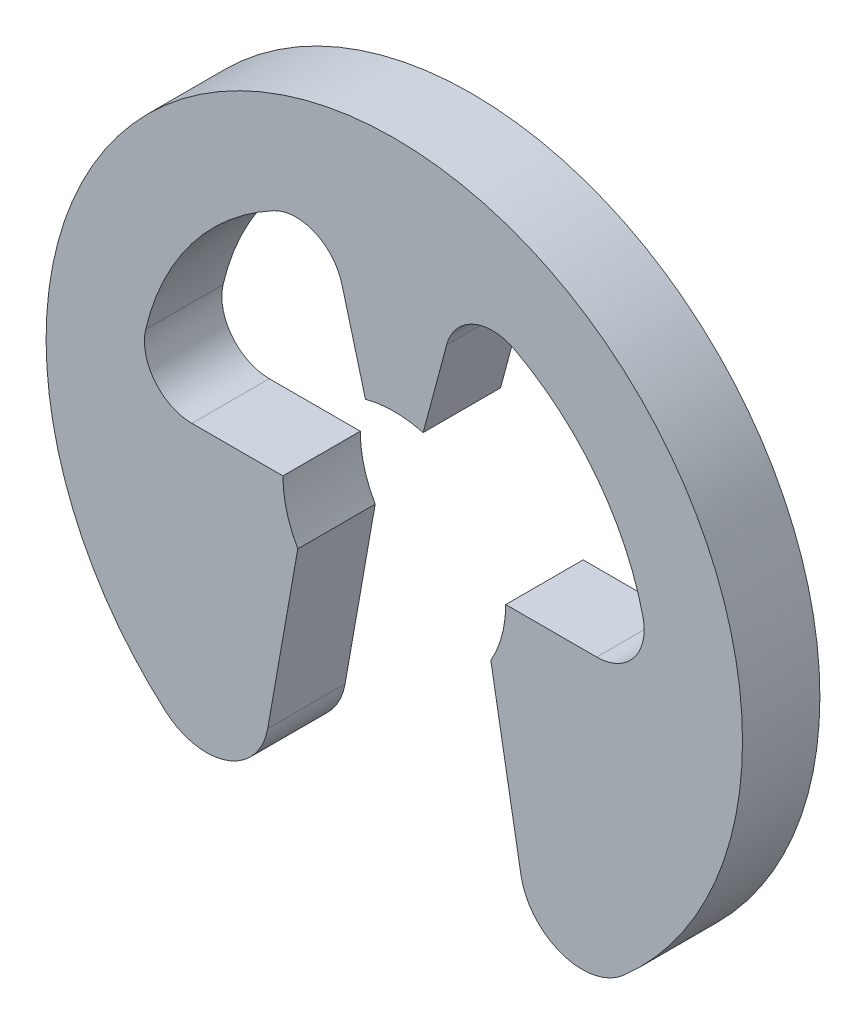
ISO-10303-21;
HEADER;
FILE_DESCRIPTION(('STEP AP214'),'2;1');
FILE_NAME('part.step','',(''),(''),'','','');
FILE_SCHEMA(('AUTOMOTIVE_DESIGN { 1 0 10303 214 1 1 1 1 }'));
ENDSEC;
DATA;
#1=APPLICATION_CONTEXT('core data for automotive mechanical design processes');
#2=APPLICATION_PROTOCOL_DEFINITION('international standard','automotive_design',2000,#1);
#3=PRODUCT_CONTEXT('',#1,'mechanical');
#4=PRODUCT('Part','Part','',(#3));
#5=PRODUCT_RELATED_PRODUCT_CATEGORY('part','',(#4));
#6=PRODUCT_DEFINITION_FORMATION('','',#4);
#7=PRODUCT_DEFINITION_CONTEXT('part definition',#1,'design');
#8=PRODUCT_DEFINITION('design','',#6,#7);
#9=PRODUCT_DEFINITION_SHAPE('','',#8);
#10=(LENGTH_UNIT() NAMED_UNIT(*) SI_UNIT(.MILLI.,.METRE.));
#11=(NAMED_UNIT(*) PLANE_ANGLE_UNIT() SI_UNIT($,.RADIAN.));
#12=(NAMED_UNIT(*) SI_UNIT($,.STERADIAN.) SOLID_ANGLE_UNIT());
#13=UNCERTAINTY_MEASURE_WITH_UNIT(LENGTH_MEASURE(1.E-05),#10,'distance_accuracy_value','');
#14=(GEOMETRIC_REPRESENTATION_CONTEXT(3) GLOBAL_UNCERTAINTY_ASSIGNED_CONTEXT((#13)) GLOBAL_UNIT_ASSIGNED_CONTEXT((#10,
#11,#12)) REPRESENTATION_CONTEXT('',''));
#15=CARTESIAN_POINT('',(0.,0.,0.));
#16=DIRECTION('',(0.,0.,1.));
#17=DIRECTION('',(1.,0.,0.));
#18=AXIS2_PLACEMENT_3D('',#15,#16,#17);
#19=CARTESIAN_POINT('',(0.653783220953245,0.15345,-0.25));
#20=DIRECTION('',(0.,0.,1.));
#21=DIRECTION('',(1.,0.,0.));
#22=AXIS2_PLACEMENT_3D('',#19,#20,#21);
#23=CYLINDRICAL_SURFACE('',#22,0.15345);
#24=CARTESIAN_POINT('',(0.653783220953245,0.15345,0.));
#25=DIRECTION('',(0.,0.,-1.));
#26=DIRECTION('',(1.,0.,0.));
#27=AXIS2_PLACEMENT_3D('',#24,#25,#26);
#28=CIRCLE('',#27,0.15345);
#29=CARTESIAN_POINT('',(0.803173490114552,0.188513513513514,0.));
#30=VERTEX_POINT('',#29);
#31=CARTESIAN_POINT('',(0.653783220953245,0.,0.));
#32=VERTEX_POINT('',#31);
#33=EDGE_CURVE('E187',#30,#32,#28,.T.);
#34=ORIENTED_EDGE('',*,*,#33,.F.);
#35=DIRECTION('',(0.,0.,1.));
#36=VECTOR('',#35,1.);
#37=CARTESIAN_POINT('',(0.803173490114552,0.188513513513514,-0.25));
#38=LINE('',#37,#36);
#39=CARTESIAN_POINT('',(0.803173490114552,0.188513513513514,-0.25));
#40=VERTEX_POINT('',#39);
#41=EDGE_CURVE('E11',#40,#30,#38,.T.);
#42=ORIENTED_EDGE('',*,*,#41,.F.);
#43=CARTESIAN_POINT('',(0.653783220953245,0.15345,-0.25));
#44=DIRECTION('',(0.,0.,-1.));
#45=DIRECTION('',(1.,0.,0.));
#46=AXIS2_PLACEMENT_3D('',#43,#44,#45);
#47=CIRCLE('',#46,0.15345);
#48=CARTESIAN_POINT('',(0.653783220953245,0.,-0.25));
#49=VERTEX_POINT('',#48);
#50=EDGE_CURVE('E237',#40,#49,#47,.T.);
#51=ORIENTED_EDGE('',*,*,#50,.T.);
#52=DIRECTION('',(0.,0.,1.));
#53=VECTOR('',#52,1.);
#54=CARTESIAN_POINT('',(0.653783220953245,0.,-0.25));
#55=LINE('',#54,#53);
#56=EDGE_CURVE('E33',#49,#32,#55,.T.);
#57=ORIENTED_EDGE('',*,*,#56,.T.);
#58=EDGE_LOOP('',(#34,#42,#51,#57));
#59=FACE_BOUND('',#58,.T.);
#60=ADVANCED_FACE('F30',(#59),#23,.F.);
#61=CARTESIAN_POINT('',(0.,0.,-0.25));
#62=DIRECTION('',(0.,0.,1.));
#63=DIRECTION('',(1.,0.,0.));
#64=AXIS2_PLACEMENT_3D('',#61,#62,#63);
#65=CYLINDRICAL_SURFACE('',#64,0.825);
#66=CARTESIAN_POINT('',(0.,0.,0.));
#67=DIRECTION('',(0.,0.,-1.));
#68=DIRECTION('',(1.,0.,0.));
#69=AXIS2_PLACEMENT_3D('',#66,#67,#68);
#70=CIRCLE('',#69,0.825);
#71=CARTESIAN_POINT('',(0.389966667070304,0.727015129535885,0.));
#72=VERTEX_POINT('',#71);
#73=EDGE_CURVE('E235',#72,#30,#70,.T.);
#74=ORIENTED_EDGE('',*,*,#73,.F.);
#75=DIRECTION('',(0.,0.,1.));
#76=VECTOR('',#75,1.);
#77=CARTESIAN_POINT('',(0.389966667070304,0.727015129535885,-0.25));
#78=LINE('',#77,#76);
#79=CARTESIAN_POINT('',(0.389966667070304,0.727015129535885,-0.25));
#80=VERTEX_POINT('',#79);
#81=EDGE_CURVE('E39',#80,#72,#78,.T.);
#82=ORIENTED_EDGE('',*,*,#81,.F.);
#83=CARTESIAN_POINT('',(0.,0.,-0.25));
#84=DIRECTION('',(0.,0.,-1.));
#85=DIRECTION('',(1.,0.,0.));
#86=AXIS2_PLACEMENT_3D('',#83,#84,#85);
#87=CIRCLE('',#86,0.825);
#88=EDGE_CURVE('E177',#80,#40,#87,.T.);
#89=ORIENTED_EDGE('',*,*,#88,.T.);
#90=ORIENTED_EDGE('',*,*,#41,.T.);
#91=EDGE_LOOP('',(#74,#82,#89,#90));
#92=FACE_BOUND('',#91,.T.);
#93=ADVANCED_FACE('F269',(#92),#65,.F.);
#94=CARTESIAN_POINT('',(0.317432866995227,0.591790315442209,-0.25));
#95=DIRECTION('',(0.,0.,1.));
#96=DIRECTION('',(1.,0.,0.));
#97=AXIS2_PLACEMENT_3D('',#94,#95,#96);
#98=CYLINDRICAL_SURFACE('',#97,0.153450000000001);
#99=CARTESIAN_POINT('',(0.317432866995227,0.591790315442209,0.));
#100=DIRECTION('',(0.,0.,-1.));
#101=DIRECTION('',(1.,0.,0.));
#102=AXIS2_PLACEMENT_3D('',#99,#100,#101);
#103=CIRCLE('',#102,0.153450000000001);
#104=CARTESIAN_POINT('',(0.169211548951169,0.63150609791319,0.));
#105=VERTEX_POINT('',#104);
#106=EDGE_CURVE('E164',#105,#72,#103,.T.);
#107=ORIENTED_EDGE('',*,*,#106,.F.);
#108=DIRECTION('',(0.,0.,1.));
#109=VECTOR('',#108,1.);
#110=CARTESIAN_POINT('',(0.169211548951169,0.63150609791319,-0.25));
#111=LINE('',#110,#109);
#112=CARTESIAN_POINT('',(0.169211548951169,0.63150609791319,-0.25));
#113=VERTEX_POINT('',#112);
#114=EDGE_CURVE('E159',#113,#105,#111,.T.);
#115=ORIENTED_EDGE('',*,*,#114,.F.);
#116=CARTESIAN_POINT('',(0.317432866995227,0.591790315442209,-0.25));
#117=DIRECTION('',(0.,0.,-1.));
#118=DIRECTION('',(1.,0.,0.));
#119=AXIS2_PLACEMENT_3D('',#116,#117,#118);
#120=CIRCLE('',#119,0.153450000000001);
#121=EDGE_CURVE('E162',#113,#80,#120,.T.);
#122=ORIENTED_EDGE('',*,*,#121,.T.);
#123=ORIENTED_EDGE('',*,*,#81,.T.);
#124=EDGE_LOOP('',(#107,#115,#122,#123));
#125=FACE_BOUND('',#124,.T.);
#126=ADVANCED_FACE('F161',(#125),#98,.F.);
#127=CARTESIAN_POINT('',(0.0931748562369079,0.347733297464065,-0.25));
#128=DIRECTION('',(0.965925826289068,-0.258819045102522,0.));
#129=DIRECTION('',(0.258819045102522,0.965925826289068,0.));
#130=AXIS2_PLACEMENT_3D('',#127,#128,#129);
#131=PLANE('',#130);
#132=DIRECTION('',(0.258819045102522,0.965925826289068,0.));
#133=VECTOR('',#132,1.);
#134=CARTESIAN_POINT('',(0.0931748562369079,0.347733297464065,0.));
#135=LINE('',#134,#133);
#136=CARTESIAN_POINT('',(0.0931748562369079,0.347733297464065,0.));
#137=VERTEX_POINT('',#136);
#138=EDGE_CURVE('E232',#137,#105,#135,.T.);
#139=ORIENTED_EDGE('',*,*,#138,.F.);
#140=DIRECTION('',(0.,0.,1.));
#141=VECTOR('',#140,1.);
#142=CARTESIAN_POINT('',(0.0931748562369079,0.347733297464065,-0.25));
#143=LINE('',#142,#141);
#144=CARTESIAN_POINT('',(0.0931748562369079,0.347733297464065,-0.25));
#145=VERTEX_POINT('',#144);
#146=EDGE_CURVE('E169',#145,#137,#143,.T.);
#147=ORIENTED_EDGE('',*,*,#146,.F.);
#148=DIRECTION('',(0.258819045102522,0.965925826289068,0.));
#149=VECTOR('',#148,1.);
#150=CARTESIAN_POINT('',(0.0931748562369079,0.347733297464065,-0.25));
#151=LINE('',#150,#149);
#152=EDGE_CURVE('E175',#145,#113,#151,.T.);
#153=ORIENTED_EDGE('',*,*,#152,.T.);
#154=ORIENTED_EDGE('',*,*,#114,.T.);
#155=EDGE_LOOP('',(#139,#147,#153,#154));
#156=FACE_BOUND('',#155,.T.);
#157=ADVANCED_FACE('F179',(#156),#131,.T.);
#158=CARTESIAN_POINT('',(0.,0.,-0.25));
#159=DIRECTION('',(0.,0.,1.));
#160=DIRECTION('',(1.,0.,0.));
#161=AXIS2_PLACEMENT_3D('',#158,#159,#160);
#162=CYLINDRICAL_SURFACE('',#161,0.36);
#163=CARTESIAN_POINT('',(0.,0.,0.));
#164=DIRECTION('',(0.,0.,-1.));
#165=DIRECTION('',(-1.,0.,0.));
#166=AXIS2_PLACEMENT_3D('',#163,#164,#165);
#167=CIRCLE('',#166,0.36);
#168=CARTESIAN_POINT('',(-0.0931748562369079,0.347733297464065,0.));
#169=VERTEX_POINT('',#168);
#170=EDGE_CURVE('E229',#169,#137,#167,.T.);
#171=ORIENTED_EDGE('',*,*,#170,.F.);
#172=DIRECTION('',(0.,0.,1.));
#173=VECTOR('',#172,1.);
#174=CARTESIAN_POINT('',(-0.0931748562369079,0.347733297464065,-0.25));
#175=LINE('',#174,#173);
#176=CARTESIAN_POINT('',(-0.0931748562369079,0.347733297464065,-0.25));
#177=VERTEX_POINT('',#176);
#178=EDGE_CURVE('E241',#177,#169,#175,.T.);
#179=ORIENTED_EDGE('',*,*,#178,.F.);
#180=CARTESIAN_POINT('',(0.,0.,-0.25));
#181=DIRECTION('',(0.,0.,-1.));
#182=DIRECTION('',(-1.,0.,0.));
#183=AXIS2_PLACEMENT_3D('',#180,#181,#182);
#184=CIRCLE('',#183,0.36);
#185=EDGE_CURVE('E180',#177,#145,#184,.T.);
#186=ORIENTED_EDGE('',*,*,#185,.T.);
#187=ORIENTED_EDGE('',*,*,#146,.T.);
#188=EDGE_LOOP('',(#171,#179,#186,#187));
#189=FACE_BOUND('',#188,.T.);
#190=ADVANCED_FACE('F282',(#189),#162,.F.);
#191=CARTESIAN_POINT('',(-0.0931748562369079,0.347733297464065,-0.25));
#192=DIRECTION('',(-0.965925826289068,-0.258819045102522,0.));
#193=DIRECTION('',(0.258819045102522,-0.965925826289068,0.));
#194=AXIS2_PLACEMENT_3D('',#191,#192,#193);
#195=PLANE('',#194);
#196=DIRECTION('',(0.258819045102522,-0.965925826289068,0.));
#197=VECTOR('',#196,1.);
#198=CARTESIAN_POINT('',(-0.0931748562369079,0.347733297464065,0.));
#199=LINE('',#198,#197);
#200=CARTESIAN_POINT('',(-0.16921154895117,0.63150609791319,0.));
#201=VERTEX_POINT('',#200);
#202=EDGE_CURVE('E226',#201,#169,#199,.T.);
#203=ORIENTED_EDGE('',*,*,#202,.F.);
#204=DIRECTION('',(0.,0.,1.));
#205=VECTOR('',#204,1.);
#206=CARTESIAN_POINT('',(-0.16921154895117,0.63150609791319,-0.25));
#207=LINE('',#206,#205);
#208=CARTESIAN_POINT('',(-0.16921154895117,0.63150609791319,-0.25));
#209=VERTEX_POINT('',#208);
#210=EDGE_CURVE('E243',#209,#201,#207,.T.);
#211=ORIENTED_EDGE('',*,*,#210,.F.);
#212=DIRECTION('',(0.258819045102522,-0.965925826289068,0.));
#213=VECTOR('',#212,1.);
#214=CARTESIAN_POINT('',(-0.0931748562369079,0.347733297464065,-0.25));
#215=LINE('',#214,#213);
#216=EDGE_CURVE('E182',#209,#177,#215,.T.);
#217=ORIENTED_EDGE('',*,*,#216,.T.);
#218=ORIENTED_EDGE('',*,*,#178,.T.);
#219=EDGE_LOOP('',(#203,#211,#217,#218));
#220=FACE_BOUND('',#219,.T.);
#221=ADVANCED_FACE('F285',(#220),#195,.T.);
#222=CARTESIAN_POINT('',(-0.317432866995227,0.591790315442209,-0.25));
#223=DIRECTION('',(0.,0.,1.));
#224=DIRECTION('',(1.,0.,0.));
#225=AXIS2_PLACEMENT_3D('',#222,#223,#224);
#226=CYLINDRICAL_SURFACE('',#225,0.153450000000001);
#227=CARTESIAN_POINT('',(-0.317432866995227,0.591790315442209,0.));
#228=DIRECTION('',(0.,0.,-1.));
#229=DIRECTION('',(1.,0.,0.));
#230=AXIS2_PLACEMENT_3D('',#227,#228,#229);
#231=CIRCLE('',#230,0.153450000000001);
#232=CARTESIAN_POINT('',(-0.389966667070303,0.727015129535884,0.));
#233=VERTEX_POINT('',#232);
#234=EDGE_CURVE('E223',#233,#201,#231,.T.);
#235=ORIENTED_EDGE('',*,*,#234,.F.);
#236=DIRECTION('',(0.,0.,1.));
#237=VECTOR('',#236,1.);
#238=CARTESIAN_POINT('',(-0.389966667070303,0.727015129535884,-0.25));
#239=LINE('',#238,#237);
#240=CARTESIAN_POINT('',(-0.389966667070303,0.727015129535884,-0.25));
#241=VERTEX_POINT('',#240);
#242=EDGE_CURVE('E245',#241,#233,#239,.T.);
#243=ORIENTED_EDGE('',*,*,#242,.F.);
#244=CARTESIAN_POINT('',(-0.317432866995227,0.591790315442209,-0.25));
#245=DIRECTION('',(0.,0.,-1.));
#246=DIRECTION('',(1.,0.,0.));
#247=AXIS2_PLACEMENT_3D('',#244,#245,#246);
#248=CIRCLE('',#247,0.153450000000001);
#249=EDGE_CURVE('E493',#241,#209,#248,.T.);
#250=ORIENTED_EDGE('',*,*,#249,.T.);
#251=ORIENTED_EDGE('',*,*,#210,.T.);
#252=EDGE_LOOP('',(#235,#243,#250,#251));
#253=FACE_BOUND('',#252,.T.);
#254=ADVANCED_FACE('F289',(#253),#226,.F.);
#255=CARTESIAN_POINT('',(0.,0.,-0.25));
#256=DIRECTION('',(0.,0.,1.));
#257=DIRECTION('',(1.,0.,0.));
#258=AXIS2_PLACEMENT_3D('',#255,#256,#257);
#259=CYLINDRICAL_SURFACE('',#258,0.824999999999999);
#260=CARTESIAN_POINT('',(0.,0.,0.));
#261=DIRECTION('',(0.,0.,-1.));
#262=DIRECTION('',(1.,0.,0.));
#263=AXIS2_PLACEMENT_3D('',#260,#261,#262);
#264=CIRCLE('',#263,0.824999999999999);
#265=CARTESIAN_POINT('',(-0.803173490114551,0.188513513513514,0.));
#266=VERTEX_POINT('',#265);
#267=EDGE_CURVE('E220',#266,#233,#264,.T.);
#268=ORIENTED_EDGE('',*,*,#267,.F.);
#269=DIRECTION('',(0.,0.,1.));
#270=VECTOR('',#269,1.);
#271=CARTESIAN_POINT('',(-0.803173490114551,0.188513513513514,-0.25));
#272=LINE('',#271,#270);
#273=CARTESIAN_POINT('',(-0.803173490114551,0.188513513513514,-0.25));
#274=VERTEX_POINT('',#273);
#275=EDGE_CURVE('E247',#274,#266,#272,.T.);
#276=ORIENTED_EDGE('',*,*,#275,.F.);
#277=CARTESIAN_POINT('',(0.,0.,-0.25));
#278=DIRECTION('',(0.,0.,-1.));
#279=DIRECTION('',(1.,0.,0.));
#280=AXIS2_PLACEMENT_3D('',#277,#278,#279);
#281=CIRCLE('',#280,0.824999999999999);
#282=EDGE_CURVE('E497',#274,#241,#281,.T.);
#283=ORIENTED_EDGE('',*,*,#282,.T.);
#284=ORIENTED_EDGE('',*,*,#242,.T.);
#285=EDGE_LOOP('',(#268,#276,#283,#284));
#286=FACE_BOUND('',#285,.T.);
#287=ADVANCED_FACE('F293',(#286),#259,.F.);
#288=CARTESIAN_POINT('',(-0.653783220953245,0.153450000000001,-0.25));
#289=DIRECTION('',(0.,0.,1.));
#290=DIRECTION('',(1.,0.,0.));
#291=AXIS2_PLACEMENT_3D('',#288,#289,#290);
#292=CYLINDRICAL_SURFACE('',#291,0.15345);
#293=CARTESIAN_POINT('',(-0.653783220953245,0.153450000000001,0.));
#294=DIRECTION('',(0.,0.,-1.));
#295=DIRECTION('',(1.,0.,0.));
#296=AXIS2_PLACEMENT_3D('',#293,#294,#295);
#297=CIRCLE('',#296,0.15345);
#298=CARTESIAN_POINT('',(-0.653783220953245,0.,0.));
#299=VERTEX_POINT('',#298);
#300=EDGE_CURVE('E217',#299,#266,#297,.T.);
#301=ORIENTED_EDGE('',*,*,#300,.F.);
#302=DIRECTION('',(0.,0.,1.));
#303=VECTOR('',#302,1.);
#304=CARTESIAN_POINT('',(-0.653783220953245,0.,-0.25));
#305=LINE('',#304,#303);
#306=CARTESIAN_POINT('',(-0.653783220953245,0.,-0.25));
#307=VERTEX_POINT('',#306);
#308=EDGE_CURVE('E249',#307,#299,#305,.T.);
#309=ORIENTED_EDGE('',*,*,#308,.F.);
#310=CARTESIAN_POINT('',(-0.653783220953245,0.153450000000001,-0.25));
#311=DIRECTION('',(0.,0.,-1.));
#312=DIRECTION('',(1.,0.,0.));
#313=AXIS2_PLACEMENT_3D('',#310,#311,#312);
#314=CIRCLE('',#313,0.15345);
#315=EDGE_CURVE('E486',#307,#274,#314,.T.);
#316=ORIENTED_EDGE('',*,*,#315,.T.);
#317=ORIENTED_EDGE('',*,*,#275,.T.);
#318=EDGE_LOOP('',(#301,#309,#316,#317));
#319=FACE_BOUND('',#318,.T.);
#320=ADVANCED_FACE('F297',(#319),#292,.F.);
#321=CARTESIAN_POINT('',(-0.36,0.,-0.25));
#322=DIRECTION('',(0.,1.,0.));
#323=DIRECTION('',(0.,0.,1.));
#324=AXIS2_PLACEMENT_3D('',#321,#322,#323);
#325=PLANE('',#324);
#326=DIRECTION('',(-1.,0.,0.));
#327=VECTOR('',#326,1.);
#328=CARTESIAN_POINT('',(-0.36,0.,0.));
#329=LINE('',#328,#327);
#330=CARTESIAN_POINT('',(-0.36,0.,0.));
#331=VERTEX_POINT('',#330);
#332=EDGE_CURVE('E214',#331,#299,#329,.T.);
#333=ORIENTED_EDGE('',*,*,#332,.F.);
#334=DIRECTION('',(0.,0.,1.));
#335=VECTOR('',#334,1.);
#336=CARTESIAN_POINT('',(-0.36,0.,-0.25));
#337=LINE('',#336,#335);
#338=CARTESIAN_POINT('',(-0.36,0.,-0.25));
#339=VERTEX_POINT('',#338);
#340=EDGE_CURVE('E251',#339,#331,#337,.T.);
#341=ORIENTED_EDGE('',*,*,#340,.F.);
#342=DIRECTION('',(-1.,0.,0.));
#343=VECTOR('',#342,1.);
#344=CARTESIAN_POINT('',(-0.36,0.,-0.25));
#345=LINE('',#344,#343);
#346=EDGE_CURVE('E482',#339,#307,#345,.T.);
#347=ORIENTED_EDGE('',*,*,#346,.T.);
#348=ORIENTED_EDGE('',*,*,#308,.T.);
#349=EDGE_LOOP('',(#333,#341,#347,#348));
#350=FACE_BOUND('',#349,.T.);
#351=ADVANCED_FACE('F301',(#350),#325,.T.);
#352=CARTESIAN_POINT('',(0.,0.,-0.25));
#353=DIRECTION('',(0.,0.,1.));
#354=DIRECTION('',(1.,0.,0.));
#355=AXIS2_PLACEMENT_3D('',#352,#353,#354);
#356=CYLINDRICAL_SURFACE('',#355,0.36);
#357=CARTESIAN_POINT('',(0.,0.,0.));
#358=DIRECTION('',(0.,0.,-1.));
#359=DIRECTION('',(1.,0.,0.));
#360=AXIS2_PLACEMENT_3D('',#357,#358,#359);
#361=CIRCLE('',#360,0.36);
#362=CARTESIAN_POINT('',(-0.311769145362398,-0.18,0.));
#363=VERTEX_POINT('',#362);
#364=EDGE_CURVE('E211',#363,#331,#361,.T.);
#365=ORIENTED_EDGE('',*,*,#364,.F.);
#366=DIRECTION('',(0.,0.,1.));
#367=VECTOR('',#366,1.);
#368=CARTESIAN_POINT('',(-0.311769145362398,-0.18,-0.25));
#369=LINE('',#368,#367);
#370=CARTESIAN_POINT('',(-0.311769145362398,-0.18,-0.25));
#371=VERTEX_POINT('',#370);
#372=EDGE_CURVE('E253',#371,#363,#369,.T.);
#373=ORIENTED_EDGE('',*,*,#372,.F.);
#374=CARTESIAN_POINT('',(0.,0.,-0.25));
#375=DIRECTION('',(0.,0.,-1.));
#376=DIRECTION('',(1.,0.,0.));
#377=AXIS2_PLACEMENT_3D('',#374,#375,#376);
#378=CIRCLE('',#377,0.36);
#379=EDGE_CURVE('E503',#371,#339,#378,.T.);
#380=ORIENTED_EDGE('',*,*,#379,.T.);
#381=ORIENTED_EDGE('',*,*,#340,.T.);
#382=EDGE_LOOP('',(#365,#373,#380,#381));
#383=FACE_BOUND('',#382,.T.);
#384=ADVANCED_FACE('F305',(#383),#356,.F.);
#385=CARTESIAN_POINT('',(-0.311769145362397,-0.18,-0.25));
#386=DIRECTION('',(0.984807753012208,-0.17364817766693,0.));
#387=DIRECTION('',(0.17364817766693,0.984807753012208,0.));
#388=AXIS2_PLACEMENT_3D('',#385,#386,#387);
#389=PLANE('',#388);
#390=DIRECTION('',(0.17364817766693,0.984807753012208,0.));
#391=VECTOR('',#390,1.);
#392=CARTESIAN_POINT('',(-0.311769145362397,-0.18,0.));
#393=LINE('',#392,#391);
#394=CARTESIAN_POINT('',(-0.409027602164805,-0.731580117867572,0.));
#395=VERTEX_POINT('',#394);
#396=EDGE_CURVE('E208',#395,#363,#393,.T.);
#397=ORIENTED_EDGE('',*,*,#396,.F.);
#398=DIRECTION('',(0.,0.,1.));
#399=VECTOR('',#398,1.);
#400=CARTESIAN_POINT('',(-0.409027602164805,-0.731580117867572,-0.25));
#401=LINE('',#400,#399);
#402=CARTESIAN_POINT('',(-0.409027602164805,-0.731580117867572,-0.25));
#403=VERTEX_POINT('',#402);
#404=EDGE_CURVE('E255',#403,#395,#401,.T.);
#405=ORIENTED_EDGE('',*,*,#404,.F.);
#406=DIRECTION('',(0.17364817766693,0.984807753012208,0.));
#407=VECTOR('',#406,1.);
#408=CARTESIAN_POINT('',(-0.311769145362397,-0.18,-0.25));
#409=LINE('',#408,#407);
#410=EDGE_CURVE('E475',#403,#371,#409,.T.);
#411=ORIENTED_EDGE('',*,*,#410,.T.);
#412=ORIENTED_EDGE('',*,*,#372,.T.);
#413=EDGE_LOOP('',(#397,#405,#411,#412));
#414=FACE_BOUND('',#413,.T.);
#415=ADVANCED_FACE('F309',(#414),#389,.T.);
#416=CARTESIAN_POINT('',(-0.606973960520261,-0.696676834156518,-0.25));
#417=DIRECTION('',(0.,0.,1.));
#418=DIRECTION('',(1.,0.,0.));
#419=AXIS2_PLACEMENT_3D('',#416,#417,#418);
#420=CYLINDRICAL_SURFACE('',#419,0.201000000000001);
#421=CARTESIAN_POINT('',(-0.606973960520261,-0.696676834156518,0.));
#422=DIRECTION('',(0.,0.,1.));
#423=DIRECTION('',(1.,0.,0.));
#424=AXIS2_PLACEMENT_3D('',#421,#422,#423);
#425=CIRCLE('',#424,0.201000000000001);
#426=CARTESIAN_POINT('',(-0.739010503880188,-0.848226664963294,0.));
#427=VERTEX_POINT('',#426);
#428=EDGE_CURVE('E205',#427,#395,#425,.T.);
#429=ORIENTED_EDGE('',*,*,#428,.F.);
#430=DIRECTION('',(0.,0.,1.));
#431=VECTOR('',#430,1.);
#432=CARTESIAN_POINT('',(-0.739010503880188,-0.848226664963294,-0.25));
#433=LINE('',#432,#431);
#434=CARTESIAN_POINT('',(-0.739010503880188,-0.848226664963294,-0.25));
#435=VERTEX_POINT('',#434);
#436=EDGE_CURVE('E257',#435,#427,#433,.T.);
#437=ORIENTED_EDGE('',*,*,#436,.F.);
#438=CARTESIAN_POINT('',(-0.606973960520261,-0.696676834156518,-0.25));
#439=DIRECTION('',(0.,0.,1.));
#440=DIRECTION('',(1.,0.,0.));
#441=AXIS2_PLACEMENT_3D('',#438,#439,#440);
#442=CIRCLE('',#441,0.201000000000001);
#443=EDGE_CURVE('E471',#435,#403,#442,.T.);
#444=ORIENTED_EDGE('',*,*,#443,.T.);
#445=ORIENTED_EDGE('',*,*,#404,.T.);
#446=EDGE_LOOP('',(#429,#437,#444,#445));
#447=FACE_BOUND('',#446,.T.);
#448=ADVANCED_FACE('F313',(#447),#420,.T.);
#449=CARTESIAN_POINT('',(0.,0.,-0.25));
#450=DIRECTION('',(0.,0.,1.));
#451=DIRECTION('',(1.,0.,0.));
#452=AXIS2_PLACEMENT_3D('',#449,#450,#451);
#453=CYLINDRICAL_SURFACE('',#452,1.125);
#454=CARTESIAN_POINT('',(0.,0.,0.));
#455=DIRECTION('',(0.,0.,1.));
#456=DIRECTION('',(1.,0.,0.));
#457=AXIS2_PLACEMENT_3D('',#454,#455,#456);
#458=CIRCLE('',#457,1.125);
#459=CARTESIAN_POINT('',(0.739010503880187,-0.848226664963294,0.));
#460=VERTEX_POINT('',#459);
#461=EDGE_CURVE('E202',#460,#427,#458,.T.);
#462=ORIENTED_EDGE('',*,*,#461,.F.);
#463=DIRECTION('',(0.,0.,1.));
#464=VECTOR('',#463,1.);
#465=CARTESIAN_POINT('',(0.739010503880187,-0.848226664963294,-0.25));
#466=LINE('',#465,#464);
#467=CARTESIAN_POINT('',(0.739010503880187,-0.848226664963294,-0.25));
#468=VERTEX_POINT('',#467);
#469=EDGE_CURVE('E259',#468,#460,#466,.T.);
#470=ORIENTED_EDGE('',*,*,#469,.F.);
#471=CARTESIAN_POINT('',(0.,0.,-0.25));
#472=DIRECTION('',(0.,0.,1.));
#473=DIRECTION('',(1.,0.,0.));
#474=AXIS2_PLACEMENT_3D('',#471,#472,#473);
#475=CIRCLE('',#474,1.125);
#476=EDGE_CURVE('E507',#468,#435,#475,.T.);
#477=ORIENTED_EDGE('',*,*,#476,.T.);
#478=ORIENTED_EDGE('',*,*,#436,.T.);
#479=EDGE_LOOP('',(#462,#470,#477,#478));
#480=FACE_BOUND('',#479,.T.);
#481=ADVANCED_FACE('F317',(#480),#453,.T.);
#482=CARTESIAN_POINT('',(0.606973960520261,-0.696676834156518,-0.25));
#483=DIRECTION('',(0.,0.,1.));
#484=DIRECTION('',(1.,0.,0.));
#485=AXIS2_PLACEMENT_3D('',#482,#483,#484);
#486=CYLINDRICAL_SURFACE('',#485,0.201000000000001);
#487=CARTESIAN_POINT('',(0.606973960520261,-0.696676834156518,0.));
#488=DIRECTION('',(0.,0.,1.));
#489=DIRECTION('',(1.,0.,0.));
#490=AXIS2_PLACEMENT_3D('',#487,#488,#489);
#491=CIRCLE('',#490,0.201000000000001);
#492=CARTESIAN_POINT('',(0.409027602164806,-0.731580117867572,0.));
#493=VERTEX_POINT('',#492);
#494=EDGE_CURVE('E199',#493,#460,#491,.T.);
#495=ORIENTED_EDGE('',*,*,#494,.F.);
#496=DIRECTION('',(0.,0.,1.));
#497=VECTOR('',#496,1.);
#498=CARTESIAN_POINT('',(0.409027602164806,-0.731580117867572,-0.25));
#499=LINE('',#498,#497);
#500=CARTESIAN_POINT('',(0.409027602164806,-0.731580117867572,-0.25));
#501=VERTEX_POINT('',#500);
#502=EDGE_CURVE('E261',#501,#493,#499,.T.);
#503=ORIENTED_EDGE('',*,*,#502,.F.);
#504=CARTESIAN_POINT('',(0.606973960520261,-0.696676834156518,-0.25));
#505=DIRECTION('',(0.,0.,1.));
#506=DIRECTION('',(1.,0.,0.));
#507=AXIS2_PLACEMENT_3D('',#504,#505,#506);
#508=CIRCLE('',#507,0.201000000000001);
#509=EDGE_CURVE('E464',#501,#468,#508,.T.);
#510=ORIENTED_EDGE('',*,*,#509,.T.);
#511=ORIENTED_EDGE('',*,*,#469,.T.);
#512=EDGE_LOOP('',(#495,#503,#510,#511));
#513=FACE_BOUND('',#512,.T.);
#514=ADVANCED_FACE('F321',(#513),#486,.T.);
#515=CARTESIAN_POINT('',(0.311769145362397,-0.18,-0.25));
#516=DIRECTION('',(-0.984807753012208,-0.17364817766693,0.));
#517=DIRECTION('',(0.17364817766693,-0.984807753012208,0.));
#518=AXIS2_PLACEMENT_3D('',#515,#516,#517);
#519=PLANE('',#518);
#520=DIRECTION('',(0.17364817766693,-0.984807753012208,0.));
#521=VECTOR('',#520,1.);
#522=CARTESIAN_POINT('',(0.311769145362397,-0.18,0.));
#523=LINE('',#522,#521);
#524=CARTESIAN_POINT('',(0.311769145362397,-0.18,0.));
#525=VERTEX_POINT('',#524);
#526=EDGE_CURVE('E196',#525,#493,#523,.T.);
#527=ORIENTED_EDGE('',*,*,#526,.F.);
#528=DIRECTION('',(0.,0.,1.));
#529=VECTOR('',#528,1.);
#530=CARTESIAN_POINT('',(0.311769145362397,-0.18,-0.25));
#531=LINE('',#530,#529);
#532=CARTESIAN_POINT('',(0.311769145362397,-0.18,-0.25));
#533=VERTEX_POINT('',#532);
#534=EDGE_CURVE('E263',#533,#525,#531,.T.);
#535=ORIENTED_EDGE('',*,*,#534,.F.);
#536=DIRECTION('',(0.17364817766693,-0.984807753012208,0.));
#537=VECTOR('',#536,1.);
#538=CARTESIAN_POINT('',(0.311769145362397,-0.18,-0.25));
#539=LINE('',#538,#537);
#540=EDGE_CURVE('E460',#533,#501,#539,.T.);
#541=ORIENTED_EDGE('',*,*,#540,.T.);
#542=ORIENTED_EDGE('',*,*,#502,.T.);
#543=EDGE_LOOP('',(#527,#535,#541,#542));
#544=FACE_BOUND('',#543,.T.);
#545=ADVANCED_FACE('F325',(#544),#519,.T.);
#546=CARTESIAN_POINT('',(0.,0.,-0.25));
#547=DIRECTION('',(0.,0.,1.));
#548=DIRECTION('',(1.,0.,0.));
#549=AXIS2_PLACEMENT_3D('',#546,#547,#548);
#550=CYLINDRICAL_SURFACE('',#549,0.36);
#551=CARTESIAN_POINT('',(0.,0.,0.));
#552=DIRECTION('',(0.,0.,-1.));
#553=DIRECTION('',(1.,0.,0.));
#554=AXIS2_PLACEMENT_3D('',#551,#552,#553);
#555=CIRCLE('',#554,0.36);
#556=CARTESIAN_POINT('',(0.36,0.,0.));
#557=VERTEX_POINT('',#556);
#558=EDGE_CURVE('E193',#557,#525,#555,.T.);
#559=ORIENTED_EDGE('',*,*,#558,.F.);
#560=DIRECTION('',(0.,0.,1.));
#561=VECTOR('',#560,1.);
#562=CARTESIAN_POINT('',(0.36,0.,-0.25));
#563=LINE('',#562,#561);
#564=CARTESIAN_POINT('',(0.36,0.,-0.25));
#565=VERTEX_POINT('',#564);
#566=EDGE_CURVE('E264',#565,#557,#563,.T.);
#567=ORIENTED_EDGE('',*,*,#566,.F.);
#568=CARTESIAN_POINT('',(0.,0.,-0.25));
#569=DIRECTION('',(0.,0.,-1.));
#570=DIRECTION('',(1.,0.,0.));
#571=AXIS2_PLACEMENT_3D('',#568,#569,#570);
#572=CIRCLE('',#571,0.36);
#573=EDGE_CURVE('E511',#565,#533,#572,.T.);
#574=ORIENTED_EDGE('',*,*,#573,.T.);
#575=ORIENTED_EDGE('',*,*,#534,.T.);
#576=EDGE_LOOP('',(#559,#567,#574,#575));
#577=FACE_BOUND('',#576,.T.);
#578=ADVANCED_FACE('F329',(#577),#550,.F.);
#579=CARTESIAN_POINT('',(0.36,0.,-0.25));
#580=DIRECTION('',(0.,1.,0.));
#581=DIRECTION('',(0.,0.,1.));
#582=AXIS2_PLACEMENT_3D('',#579,#580,#581);
#583=PLANE('',#582);
#584=DIRECTION('',(-1.,0.,0.));
#585=VECTOR('',#584,1.);
#586=CARTESIAN_POINT('',(0.36,0.,0.));
#587=LINE('',#586,#585);
#588=EDGE_CURVE('E190',#32,#557,#587,.T.);
#589=ORIENTED_EDGE('',*,*,#588,.F.);
#590=ORIENTED_EDGE('',*,*,#56,.F.);
#591=DIRECTION('',(-1.,0.,0.));
#592=VECTOR('',#591,1.);
#593=CARTESIAN_POINT('',(0.36,0.,-0.25));
#594=LINE('',#593,#592);
#595=EDGE_CURVE('E513',#49,#565,#594,.T.);
#596=ORIENTED_EDGE('',*,*,#595,.T.);
#597=ORIENTED_EDGE('',*,*,#566,.T.);
#598=EDGE_LOOP('',(#589,#590,#596,#597));
#599=FACE_BOUND('',#598,.T.);
#600=ADVANCED_FACE('F266',(#599),#583,.T.);
#601=CARTESIAN_POINT('',(0.653783220953245,0.15345,-0.25));
#602=DIRECTION('',(0.,0.,1.));
#603=DIRECTION('',(1.,0.,0.));
#604=AXIS2_PLACEMENT_3D('',#601,#602,#603);
#605=PLANE('',#604);
#606=ORIENTED_EDGE('',*,*,#50,.F.);
#607=ORIENTED_EDGE('',*,*,#88,.F.);
#608=ORIENTED_EDGE('',*,*,#121,.F.);
#609=ORIENTED_EDGE('',*,*,#152,.F.);
#610=ORIENTED_EDGE('',*,*,#185,.F.);
#611=ORIENTED_EDGE('',*,*,#216,.F.);
#612=ORIENTED_EDGE('',*,*,#249,.F.);
#613=ORIENTED_EDGE('',*,*,#282,.F.);
#614=ORIENTED_EDGE('',*,*,#315,.F.);
#615=ORIENTED_EDGE('',*,*,#346,.F.);
#616=ORIENTED_EDGE('',*,*,#379,.F.);
#617=ORIENTED_EDGE('',*,*,#410,.F.);
#618=ORIENTED_EDGE('',*,*,#443,.F.);
#619=ORIENTED_EDGE('',*,*,#476,.F.);
#620=ORIENTED_EDGE('',*,*,#509,.F.);
#621=ORIENTED_EDGE('',*,*,#540,.F.);
#622=ORIENTED_EDGE('',*,*,#573,.F.);
#623=ORIENTED_EDGE('',*,*,#595,.F.);
#624=EDGE_LOOP('',(#606,#607,#608,#609,#610,#611,#612,#613,#614,#615,#616,#617,#618,#619,#620,
#621,#622,#623));
#625=FACE_BOUND('',#624,.T.);
#626=ADVANCED_FACE('F173',(#625),#605,.F.);
#627=CARTESIAN_POINT('',(0.653783220953245,0.15345,0.));
#628=DIRECTION('',(0.,0.,1.));
#629=DIRECTION('',(1.,0.,0.));
#630=AXIS2_PLACEMENT_3D('',#627,#628,#629);
#631=PLANE('',#630);
#632=ORIENTED_EDGE('',*,*,#33,.T.);
#633=ORIENTED_EDGE('',*,*,#588,.T.);
#634=ORIENTED_EDGE('',*,*,#558,.T.);
#635=ORIENTED_EDGE('',*,*,#526,.T.);
#636=ORIENTED_EDGE('',*,*,#494,.T.);
#637=ORIENTED_EDGE('',*,*,#461,.T.);
#638=ORIENTED_EDGE('',*,*,#428,.T.);
#639=ORIENTED_EDGE('',*,*,#396,.T.);
#640=ORIENTED_EDGE('',*,*,#364,.T.);
#641=ORIENTED_EDGE('',*,*,#332,.T.);
#642=ORIENTED_EDGE('',*,*,#300,.T.);
#643=ORIENTED_EDGE('',*,*,#267,.T.);
#644=ORIENTED_EDGE('',*,*,#234,.T.);
#645=ORIENTED_EDGE('',*,*,#202,.T.);
#646=ORIENTED_EDGE('',*,*,#170,.T.);
#647=ORIENTED_EDGE('',*,*,#138,.T.);
#648=ORIENTED_EDGE('',*,*,#106,.T.);
#649=ORIENTED_EDGE('',*,*,#73,.T.);
#650=EDGE_LOOP('',(#632,#633,#634,#635,#636,#637,#638,#639,#640,#641,#642,#643,#644,#645,#646,
#647,#648,#649));
#651=FACE_BOUND('',#650,.T.);
#652=ADVANCED_FACE('F268',(#651),#631,.T.);
#653=CLOSED_SHELL('',(#60,#93,#126,#157,#190,#221,#254,#287,#320,#351,#384,#415,#448,#481,#514,
#545,#578,#600,#626,#652));
#654=MANIFOLD_SOLID_BREP('B2',#653);
#655=ADVANCED_BREP_SHAPE_REPRESENTATION('',(#18,#654),#14);
#656=SHAPE_DEFINITION_REPRESENTATION(#9,#655);
ENDSEC;
END-ISO-10303-21;
